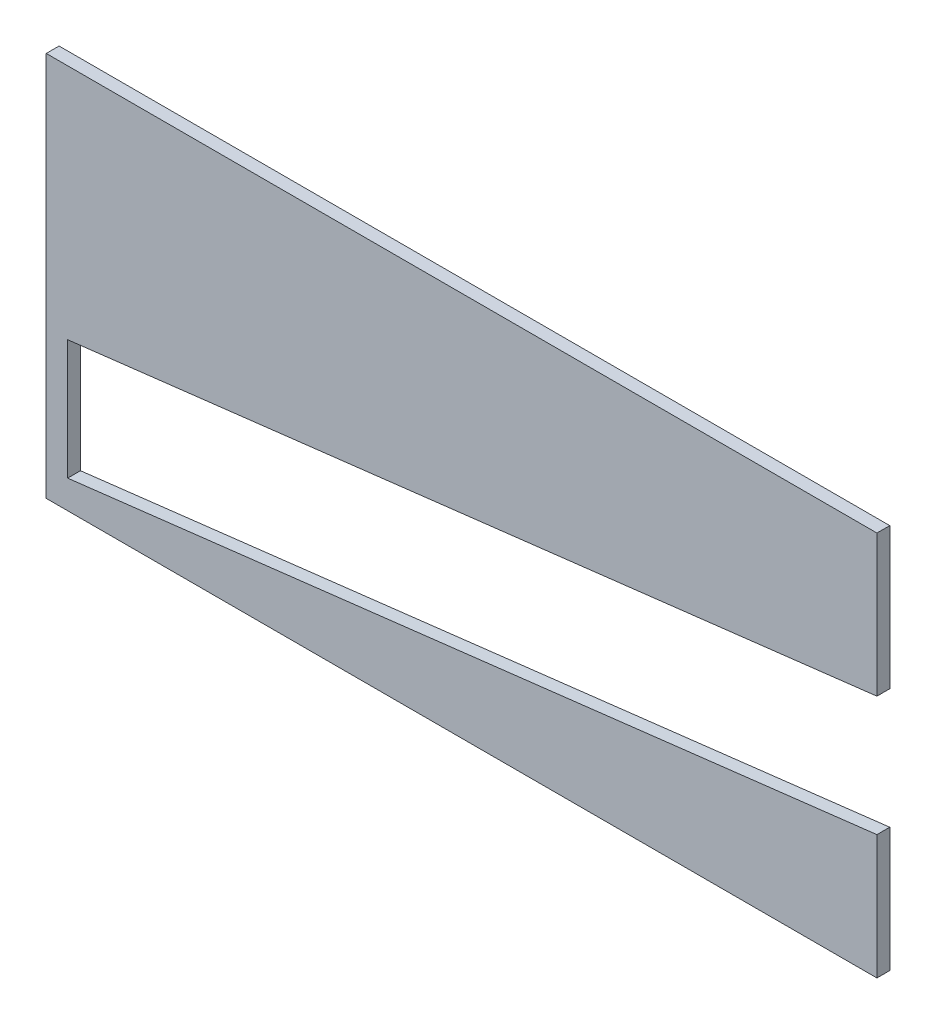
ISO-10303-21;
HEADER;
FILE_DESCRIPTION(('STEP AP214'),'2;1');
FILE_NAME('part.step','',(''),(''),'','','');
FILE_SCHEMA(('AUTOMOTIVE_DESIGN { 1 0 10303 214 1 1 1 1 }'));
ENDSEC;
DATA;
#1=APPLICATION_CONTEXT('core data for automotive mechanical design processes');
#2=APPLICATION_PROTOCOL_DEFINITION('international standard','automotive_design',2000,#1);
#3=PRODUCT_CONTEXT('',#1,'mechanical');
#4=PRODUCT('Part','Part','',(#3));
#5=PRODUCT_RELATED_PRODUCT_CATEGORY('part','',(#4));
#6=PRODUCT_DEFINITION_FORMATION('','',#4);
#7=PRODUCT_DEFINITION_CONTEXT('part definition',#1,'design');
#8=PRODUCT_DEFINITION('design','',#6,#7);
#9=PRODUCT_DEFINITION_SHAPE('','',#8);
#10=(LENGTH_UNIT() NAMED_UNIT(*) SI_UNIT(.MILLI.,.METRE.));
#11=(NAMED_UNIT(*) PLANE_ANGLE_UNIT() SI_UNIT($,.RADIAN.));
#12=(NAMED_UNIT(*) SI_UNIT($,.STERADIAN.) SOLID_ANGLE_UNIT());
#13=UNCERTAINTY_MEASURE_WITH_UNIT(LENGTH_MEASURE(1.E-05),#10,'distance_accuracy_value','');
#14=(GEOMETRIC_REPRESENTATION_CONTEXT(3) GLOBAL_UNCERTAINTY_ASSIGNED_CONTEXT((#13)) GLOBAL_UNIT_ASSIGNED_CONTEXT((#10,
#11,#12)) REPRESENTATION_CONTEXT('',''));
#15=CARTESIAN_POINT('',(0.,0.,0.));
#16=DIRECTION('',(0.,0.,1.));
#17=DIRECTION('',(1.,0.,0.));
#18=AXIS2_PLACEMENT_3D('',#15,#16,#17);
#19=CARTESIAN_POINT('',(-95.6822046765867,43.9588014981274,3.));
#20=DIRECTION('',(1.,0.,0.));
#21=DIRECTION('',(0.,1.,0.));
#22=AXIS2_PLACEMENT_3D('',#19,#20,#21);
#23=PLANE('',#22);
#24=DIRECTION('',(0.,-1.,0.));
#25=VECTOR('',#24,1.);
#26=CARTESIAN_POINT('',(-95.6822046765867,43.9588014981274,0.));
#27=LINE('',#26,#25);
#28=CARTESIAN_POINT('',(-95.6822046765867,43.9588014981274,0.));
#29=VERTEX_POINT('',#28);
#30=CARTESIAN_POINT('',(-95.6822046765867,-46.0411985018727,0.));
#31=VERTEX_POINT('',#30);
#32=EDGE_CURVE('E142',#29,#31,#27,.T.);
#33=ORIENTED_EDGE('',*,*,#32,.T.);
#34=DIRECTION('',(0.,0.,-1.));
#35=VECTOR('',#34,1.);
#36=CARTESIAN_POINT('',(-95.6822046765867,-46.0411985018727,3.));
#37=LINE('',#36,#35);
#38=CARTESIAN_POINT('',(-95.6822046765867,-46.0411985018727,3.));
#39=VERTEX_POINT('',#38);
#40=EDGE_CURVE('E11',#39,#31,#37,.T.);
#41=ORIENTED_EDGE('',*,*,#40,.F.);
#42=DIRECTION('',(0.,-1.,0.));
#43=VECTOR('',#42,1.);
#44=CARTESIAN_POINT('',(-95.6822046765867,43.9588014981274,3.));
#45=LINE('',#44,#43);
#46=CARTESIAN_POINT('',(-95.6822046765867,43.9588014981274,3.));
#47=VERTEX_POINT('',#46);
#48=EDGE_CURVE('E169',#47,#39,#45,.T.);
#49=ORIENTED_EDGE('',*,*,#48,.F.);
#50=DIRECTION('',(0.,0.,-1.));
#51=VECTOR('',#50,1.);
#52=CARTESIAN_POINT('',(-95.6822046765867,43.9588014981274,3.));
#53=LINE('',#52,#51);
#54=EDGE_CURVE('E56',#47,#29,#53,.T.);
#55=ORIENTED_EDGE('',*,*,#54,.T.);
#56=EDGE_LOOP('',(#33,#41,#49,#55));
#57=FACE_BOUND('',#56,.T.);
#58=ADVANCED_FACE('F39',(#57),#23,.F.);
#59=CARTESIAN_POINT('',(-95.6822046765867,-46.0411985018727,3.));
#60=DIRECTION('',(0.,1.,0.));
#61=DIRECTION('',(-1.,0.,0.));
#62=AXIS2_PLACEMENT_3D('',#59,#60,#61);
#63=PLANE('',#62);
#64=DIRECTION('',(1.,0.,0.));
#65=VECTOR('',#64,1.);
#66=CARTESIAN_POINT('',(-95.6822046765867,-46.0411985018727,0.));
#67=LINE('',#66,#65);
#68=CARTESIAN_POINT('',(98.3177953234133,-46.0411985018726,0.));
#69=VERTEX_POINT('',#68);
#70=EDGE_CURVE('E145',#31,#69,#67,.T.);
#71=ORIENTED_EDGE('',*,*,#70,.T.);
#72=DIRECTION('',(0.,0.,-1.));
#73=VECTOR('',#72,1.);
#74=CARTESIAN_POINT('',(98.3177953234133,-46.0411985018726,3.));
#75=LINE('',#74,#73);
#76=CARTESIAN_POINT('',(98.3177953234133,-46.0411985018726,3.));
#77=VERTEX_POINT('',#76);
#78=EDGE_CURVE('E48',#77,#69,#75,.T.);
#79=ORIENTED_EDGE('',*,*,#78,.F.);
#80=DIRECTION('',(1.,0.,0.));
#81=VECTOR('',#80,1.);
#82=CARTESIAN_POINT('',(-95.6822046765867,-46.0411985018727,3.));
#83=LINE('',#82,#81);
#84=EDGE_CURVE('E94',#39,#77,#83,.T.);
#85=ORIENTED_EDGE('',*,*,#84,.F.);
#86=ORIENTED_EDGE('',*,*,#40,.T.);
#87=EDGE_LOOP('',(#71,#79,#85,#86));
#88=FACE_BOUND('',#87,.T.);
#89=ADVANCED_FACE('F188',(#88),#63,.F.);
#90=CARTESIAN_POINT('',(98.3177953234133,-17.0411985018727,3.));
#91=DIRECTION('',(1.,0.,0.));
#92=DIRECTION('',(0.,0.,-1.));
#93=AXIS2_PLACEMENT_3D('',#90,#91,#92);
#94=PLANE('',#93);
#95=DIRECTION('',(0.,-1.,0.));
#96=VECTOR('',#95,1.);
#97=CARTESIAN_POINT('',(98.3177953234133,-17.0411985018727,0.));
#98=LINE('',#97,#96);
#99=CARTESIAN_POINT('',(98.3177953234133,-17.0411985018727,0.));
#100=VERTEX_POINT('',#99);
#101=EDGE_CURVE('E149',#100,#69,#98,.T.);
#102=ORIENTED_EDGE('',*,*,#101,.F.);
#103=DIRECTION('',(0.,0.,-1.));
#104=VECTOR('',#103,1.);
#105=CARTESIAN_POINT('',(98.3177953234133,-17.0411985018727,3.));
#106=LINE('',#105,#104);
#107=CARTESIAN_POINT('',(98.3177953234133,-17.0411985018727,3.));
#108=VERTEX_POINT('',#107);
#109=EDGE_CURVE('E179',#108,#100,#106,.T.);
#110=ORIENTED_EDGE('',*,*,#109,.F.);
#111=DIRECTION('',(0.,-1.,0.));
#112=VECTOR('',#111,1.);
#113=CARTESIAN_POINT('',(98.3177953234133,-17.0411985018727,3.));
#114=LINE('',#113,#112);
#115=EDGE_CURVE('E187',#108,#77,#114,.T.);
#116=ORIENTED_EDGE('',*,*,#115,.T.);
#117=ORIENTED_EDGE('',*,*,#78,.T.);
#118=EDGE_LOOP('',(#102,#110,#116,#117));
#119=FACE_BOUND('',#118,.T.);
#120=ADVANCED_FACE('F185',(#119),#94,.T.);
#121=CARTESIAN_POINT('',(-90.6822046765867,-39.4411985018726,3.));
#122=DIRECTION('',(-0.117694792927452,0.993049815325376,0.));
#123=DIRECTION('',(-0.993049815325376,-0.117694792927452,0.));
#124=AXIS2_PLACEMENT_3D('',#121,#122,#123);
#125=PLANE('',#124);
#126=DIRECTION('',(0.993049815325376,0.117694792927452,0.));
#127=VECTOR('',#126,1.);
#128=CARTESIAN_POINT('',(-90.6822046765867,-39.4411985018726,0.));
#129=LINE('',#128,#127);
#130=CARTESIAN_POINT('',(-90.6822046765867,-39.4411985018726,0.));
#131=VERTEX_POINT('',#130);
#132=EDGE_CURVE('E153',#131,#100,#129,.T.);
#133=ORIENTED_EDGE('',*,*,#132,.F.);
#134=DIRECTION('',(0.,0.,-1.));
#135=VECTOR('',#134,1.);
#136=CARTESIAN_POINT('',(-90.6822046765867,-39.4411985018726,3.));
#137=LINE('',#136,#135);
#138=CARTESIAN_POINT('',(-90.6822046765867,-39.4411985018726,3.));
#139=VERTEX_POINT('',#138);
#140=EDGE_CURVE('E176',#139,#131,#137,.T.);
#141=ORIENTED_EDGE('',*,*,#140,.F.);
#142=DIRECTION('',(0.993049815325376,0.117694792927452,0.));
#143=VECTOR('',#142,1.);
#144=CARTESIAN_POINT('',(-90.6822046765867,-39.4411985018726,3.));
#145=LINE('',#144,#143);
#146=EDGE_CURVE('E197',#139,#108,#145,.T.);
#147=ORIENTED_EDGE('',*,*,#146,.T.);
#148=ORIENTED_EDGE('',*,*,#109,.T.);
#149=EDGE_LOOP('',(#133,#141,#147,#148));
#150=FACE_BOUND('',#149,.T.);
#151=ADVANCED_FACE('F195',(#150),#125,.T.);
#152=CARTESIAN_POINT('',(-90.6822046765867,-39.4411985018726,3.));
#153=DIRECTION('',(-1.,0.,0.));
#154=DIRECTION('',(0.,0.,1.));
#155=AXIS2_PLACEMENT_3D('',#152,#153,#154);
#156=PLANE('',#155);
#157=DIRECTION('',(0.,1.,0.));
#158=VECTOR('',#157,1.);
#159=CARTESIAN_POINT('',(-90.6822046765867,-39.4411985018726,0.));
#160=LINE('',#159,#158);
#161=CARTESIAN_POINT('',(-90.6822046765867,-11.4411985018727,0.));
#162=VERTEX_POINT('',#161);
#163=EDGE_CURVE('E157',#131,#162,#160,.T.);
#164=ORIENTED_EDGE('',*,*,#163,.T.);
#165=DIRECTION('',(0.,0.,-1.));
#166=VECTOR('',#165,1.);
#167=CARTESIAN_POINT('',(-90.6822046765867,-11.4411985018727,3.));
#168=LINE('',#167,#166);
#169=CARTESIAN_POINT('',(-90.6822046765867,-11.4411985018727,3.));
#170=VERTEX_POINT('',#169);
#171=EDGE_CURVE('E132',#170,#162,#168,.T.);
#172=ORIENTED_EDGE('',*,*,#171,.F.);
#173=DIRECTION('',(0.,1.,0.));
#174=VECTOR('',#173,1.);
#175=CARTESIAN_POINT('',(-90.6822046765867,-39.4411985018726,3.));
#176=LINE('',#175,#174);
#177=EDGE_CURVE('E118',#139,#170,#176,.T.);
#178=ORIENTED_EDGE('',*,*,#177,.F.);
#179=ORIENTED_EDGE('',*,*,#140,.T.);
#180=EDGE_LOOP('',(#164,#172,#178,#179));
#181=FACE_BOUND('',#180,.T.);
#182=ADVANCED_FACE('F228',(#181),#156,.F.);
#183=CARTESIAN_POINT('',(-90.6822046765867,-11.4411985018727,3.));
#184=DIRECTION('',(-0.117694792927452,0.993049815325376,0.));
#185=DIRECTION('',(-0.993049815325376,-0.117694792927452,0.));
#186=AXIS2_PLACEMENT_3D('',#183,#184,#185);
#187=PLANE('',#186);
#188=DIRECTION('',(0.993049815325376,0.117694792927452,0.));
#189=VECTOR('',#188,1.);
#190=CARTESIAN_POINT('',(-90.6822046765867,-11.4411985018727,0.));
#191=LINE('',#190,#189);
#192=CARTESIAN_POINT('',(98.3177953234133,10.9588014981273,0.));
#193=VERTEX_POINT('',#192);
#194=EDGE_CURVE('E128',#162,#193,#191,.T.);
#195=ORIENTED_EDGE('',*,*,#194,.T.);
#196=DIRECTION('',(0.,0.,-1.));
#197=VECTOR('',#196,1.);
#198=CARTESIAN_POINT('',(98.3177953234133,10.9588014981273,3.));
#199=LINE('',#198,#197);
#200=CARTESIAN_POINT('',(98.3177953234133,10.9588014981273,3.));
#201=VERTEX_POINT('',#200);
#202=EDGE_CURVE('E125',#201,#193,#199,.T.);
#203=ORIENTED_EDGE('',*,*,#202,.F.);
#204=DIRECTION('',(0.993049815325376,0.117694792927452,0.));
#205=VECTOR('',#204,1.);
#206=CARTESIAN_POINT('',(-90.6822046765867,-11.4411985018727,3.));
#207=LINE('',#206,#205);
#208=EDGE_CURVE('E110',#170,#201,#207,.T.);
#209=ORIENTED_EDGE('',*,*,#208,.F.);
#210=ORIENTED_EDGE('',*,*,#171,.T.);
#211=EDGE_LOOP('',(#195,#203,#209,#210));
#212=FACE_BOUND('',#211,.T.);
#213=ADVANCED_FACE('F126',(#212),#187,.F.);
#214=CARTESIAN_POINT('',(98.3177953234133,43.9588014981274,3.));
#215=DIRECTION('',(1.,0.,0.));
#216=DIRECTION('',(0.,1.,0.));
#217=AXIS2_PLACEMENT_3D('',#214,#215,#216);
#218=PLANE('',#217);
#219=DIRECTION('',(0.,-1.,0.));
#220=VECTOR('',#219,1.);
#221=CARTESIAN_POINT('',(98.3177953234133,43.9588014981274,0.));
#222=LINE('',#221,#220);
#223=CARTESIAN_POINT('',(98.3177953234133,43.9588014981274,0.));
#224=VERTEX_POINT('',#223);
#225=EDGE_CURVE('E162',#224,#193,#222,.T.);
#226=ORIENTED_EDGE('',*,*,#225,.F.);
#227=DIRECTION('',(0.,0.,-1.));
#228=VECTOR('',#227,1.);
#229=CARTESIAN_POINT('',(98.3177953234133,43.9588014981274,3.));
#230=LINE('',#229,#228);
#231=CARTESIAN_POINT('',(98.3177953234133,43.9588014981274,3.));
#232=VERTEX_POINT('',#231);
#233=EDGE_CURVE('E82',#232,#224,#230,.T.);
#234=ORIENTED_EDGE('',*,*,#233,.F.);
#235=DIRECTION('',(0.,-1.,0.));
#236=VECTOR('',#235,1.);
#237=CARTESIAN_POINT('',(98.3177953234133,43.9588014981274,3.));
#238=LINE('',#237,#236);
#239=EDGE_CURVE('E115',#232,#201,#238,.T.);
#240=ORIENTED_EDGE('',*,*,#239,.T.);
#241=ORIENTED_EDGE('',*,*,#202,.T.);
#242=EDGE_LOOP('',(#226,#234,#240,#241));
#243=FACE_BOUND('',#242,.T.);
#244=ADVANCED_FACE('F134',(#243),#218,.T.);
#245=CARTESIAN_POINT('',(-95.6822046765867,43.9588014981274,3.));
#246=DIRECTION('',(0.,1.,0.));
#247=DIRECTION('',(0.,0.,1.));
#248=AXIS2_PLACEMENT_3D('',#245,#246,#247);
#249=PLANE('',#248);
#250=DIRECTION('',(1.,0.,0.));
#251=VECTOR('',#250,1.);
#252=CARTESIAN_POINT('',(-95.6822046765867,43.9588014981274,0.));
#253=LINE('',#252,#251);
#254=EDGE_CURVE('E165',#29,#224,#253,.T.);
#255=ORIENTED_EDGE('',*,*,#254,.F.);
#256=ORIENTED_EDGE('',*,*,#54,.F.);
#257=DIRECTION('',(1.,0.,0.));
#258=VECTOR('',#257,1.);
#259=CARTESIAN_POINT('',(-95.6822046765867,43.9588014981274,3.));
#260=LINE('',#259,#258);
#261=EDGE_CURVE('E136',#47,#232,#260,.T.);
#262=ORIENTED_EDGE('',*,*,#261,.T.);
#263=ORIENTED_EDGE('',*,*,#233,.T.);
#264=EDGE_LOOP('',(#255,#256,#262,#263));
#265=FACE_BOUND('',#264,.T.);
#266=ADVANCED_FACE('F207',(#265),#249,.T.);
#267=CARTESIAN_POINT('',(0.,0.,3.));
#268=DIRECTION('',(0.,0.,1.));
#269=DIRECTION('',(1.,0.,0.));
#270=AXIS2_PLACEMENT_3D('',#267,#268,#269);
#271=PLANE('',#270);
#272=ORIENTED_EDGE('',*,*,#48,.T.);
#273=ORIENTED_EDGE('',*,*,#84,.T.);
#274=ORIENTED_EDGE('',*,*,#115,.F.);
#275=ORIENTED_EDGE('',*,*,#146,.F.);
#276=ORIENTED_EDGE('',*,*,#177,.T.);
#277=ORIENTED_EDGE('',*,*,#208,.T.);
#278=ORIENTED_EDGE('',*,*,#239,.F.);
#279=ORIENTED_EDGE('',*,*,#261,.F.);
#280=EDGE_LOOP('',(#272,#273,#274,#275,#276,#277,#278,#279));
#281=FACE_BOUND('',#280,.T.);
#282=ADVANCED_FACE('F112',(#281),#271,.T.);
#283=CARTESIAN_POINT('',(0.,0.,0.));
#284=DIRECTION('',(0.,0.,1.));
#285=DIRECTION('',(1.,0.,0.));
#286=AXIS2_PLACEMENT_3D('',#283,#284,#285);
#287=PLANE('',#286);
#288=ORIENTED_EDGE('',*,*,#32,.F.);
#289=ORIENTED_EDGE('',*,*,#254,.T.);
#290=ORIENTED_EDGE('',*,*,#225,.T.);
#291=ORIENTED_EDGE('',*,*,#194,.F.);
#292=ORIENTED_EDGE('',*,*,#163,.F.);
#293=ORIENTED_EDGE('',*,*,#132,.T.);
#294=ORIENTED_EDGE('',*,*,#101,.T.);
#295=ORIENTED_EDGE('',*,*,#70,.F.);
#296=EDGE_LOOP('',(#288,#289,#290,#291,#292,#293,#294,#295));
#297=FACE_BOUND('',#296,.T.);
#298=ADVANCED_FACE('F191',(#297),#287,.F.);
#299=CLOSED_SHELL('',(#58,#89,#120,#151,#182,#213,#244,#266,#282,#298));
#300=MANIFOLD_SOLID_BREP('B2',#299);
#301=ADVANCED_BREP_SHAPE_REPRESENTATION('',(#18,#300),#14);
#302=SHAPE_DEFINITION_REPRESENTATION(#9,#301);
ENDSEC;
END-ISO-10303-21;
